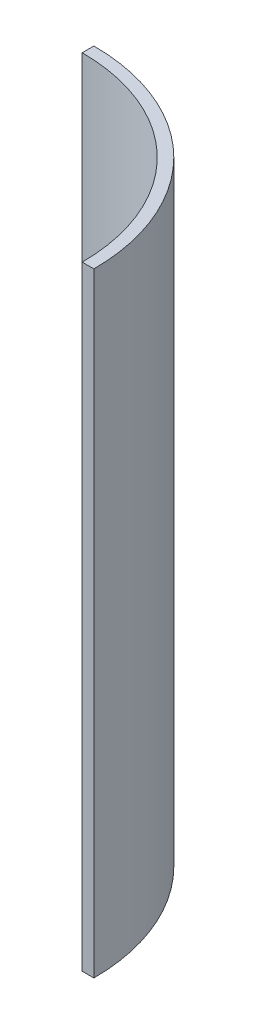
ISO-10303-21;
HEADER;
FILE_DESCRIPTION(('STEP AP214'),'2;1');
FILE_NAME('part.step','',(''),(''),'','','');
FILE_SCHEMA(('AUTOMOTIVE_DESIGN { 1 0 10303 214 1 1 1 1 }'));
ENDSEC;
DATA;
#1=APPLICATION_CONTEXT('core data for automotive mechanical design processes');
#2=APPLICATION_PROTOCOL_DEFINITION('international standard','automotive_design',2000,#1);
#3=PRODUCT_CONTEXT('',#1,'mechanical');
#4=PRODUCT('Part','Part','',(#3));
#5=PRODUCT_RELATED_PRODUCT_CATEGORY('part','',(#4));
#6=PRODUCT_DEFINITION_FORMATION('','',#4);
#7=PRODUCT_DEFINITION_CONTEXT('part definition',#1,'design');
#8=PRODUCT_DEFINITION('design','',#6,#7);
#9=PRODUCT_DEFINITION_SHAPE('','',#8);
#10=(LENGTH_UNIT() NAMED_UNIT(*) SI_UNIT(.MILLI.,.METRE.));
#11=(NAMED_UNIT(*) PLANE_ANGLE_UNIT() SI_UNIT($,.RADIAN.));
#12=(NAMED_UNIT(*) SI_UNIT($,.STERADIAN.) SOLID_ANGLE_UNIT());
#13=UNCERTAINTY_MEASURE_WITH_UNIT(LENGTH_MEASURE(1.E-05),#10,'distance_accuracy_value','');
#14=(GEOMETRIC_REPRESENTATION_CONTEXT(3) GLOBAL_UNCERTAINTY_ASSIGNED_CONTEXT((#13)) GLOBAL_UNIT_ASSIGNED_CONTEXT((#10,
#11,#12)) REPRESENTATION_CONTEXT('',''));
#15=CARTESIAN_POINT('',(0.,0.,0.));
#16=DIRECTION('',(0.,0.,1.));
#17=DIRECTION('',(1.,0.,0.));
#18=AXIS2_PLACEMENT_3D('',#15,#16,#17);
#19=CARTESIAN_POINT('',(0.,110.,0.));
#20=DIRECTION('',(0.,1.,0.));
#21=DIRECTION('',(0.,0.,1.));
#22=AXIS2_PLACEMENT_3D('',#19,#20,#21);
#23=PLANE('',#22);
#24=DIRECTION('',(0.,0.,-1.));
#25=VECTOR('',#24,1.);
#26=CARTESIAN_POINT('',(0.,110.,0.));
#27=LINE('',#26,#25);
#28=CARTESIAN_POINT('',(0.,110.,-31.));
#29=VERTEX_POINT('',#28);
#30=CARTESIAN_POINT('',(0.,110.,-33.));
#31=VERTEX_POINT('',#30);
#32=EDGE_CURVE('E73',#29,#31,#27,.T.);
#33=ORIENTED_EDGE('',*,*,#32,.F.);
#34=CARTESIAN_POINT('',(0.,110.,0.));
#35=DIRECTION('',(0.,1.,0.));
#36=DIRECTION('',(0.,0.,1.));
#37=AXIS2_PLACEMENT_3D('',#34,#35,#36);
#38=CIRCLE('',#37,31.);
#39=CARTESIAN_POINT('',(31.,110.,0.));
#40=VERTEX_POINT('',#39);
#41=EDGE_CURVE('E92',#40,#29,#38,.T.);
#42=ORIENTED_EDGE('',*,*,#41,.F.);
#43=DIRECTION('',(-1.,0.,0.));
#44=VECTOR('',#43,1.);
#45=CARTESIAN_POINT('',(0.,110.,0.));
#46=LINE('',#45,#44);
#47=CARTESIAN_POINT('',(33.,110.,0.));
#48=VERTEX_POINT('',#47);
#49=EDGE_CURVE('E54',#48,#40,#46,.T.);
#50=ORIENTED_EDGE('',*,*,#49,.F.);
#51=CARTESIAN_POINT('',(0.,110.,0.));
#52=DIRECTION('',(0.,1.,0.));
#53=DIRECTION('',(0.,0.,1.));
#54=AXIS2_PLACEMENT_3D('',#51,#52,#53);
#55=CIRCLE('',#54,33.);
#56=EDGE_CURVE('E91',#48,#31,#55,.T.);
#57=ORIENTED_EDGE('',*,*,#56,.T.);
#58=EDGE_LOOP('',(#33,#42,#50,#57));
#59=FACE_BOUND('',#58,.T.);
#60=ADVANCED_FACE('F32',(#59),#23,.T.);
#61=CARTESIAN_POINT('',(0.,5.,0.));
#62=DIRECTION('',(0.,1.,0.));
#63=DIRECTION('',(0.,0.,1.));
#64=AXIS2_PLACEMENT_3D('',#61,#62,#63);
#65=PLANE('',#64);
#66=CARTESIAN_POINT('',(0.,5.,0.));
#67=DIRECTION('',(0.,1.,0.));
#68=DIRECTION('',(0.,0.,1.));
#69=AXIS2_PLACEMENT_3D('',#66,#67,#68);
#70=CIRCLE('',#69,31.);
#71=CARTESIAN_POINT('',(31.,5.,0.));
#72=VERTEX_POINT('',#71);
#73=CARTESIAN_POINT('',(0.,5.,-31.));
#74=VERTEX_POINT('',#73);
#75=EDGE_CURVE('E78',#72,#74,#70,.T.);
#76=ORIENTED_EDGE('',*,*,#75,.T.);
#77=DIRECTION('',(0.,0.,-1.));
#78=VECTOR('',#77,1.);
#79=CARTESIAN_POINT('',(0.,5.,0.));
#80=LINE('',#79,#78);
#81=CARTESIAN_POINT('',(0.,5.,-33.));
#82=VERTEX_POINT('',#81);
#83=EDGE_CURVE('E46',#74,#82,#80,.T.);
#84=ORIENTED_EDGE('',*,*,#83,.T.);
#85=CARTESIAN_POINT('',(0.,5.,0.));
#86=DIRECTION('',(0.,1.,0.));
#87=DIRECTION('',(0.,0.,1.));
#88=AXIS2_PLACEMENT_3D('',#85,#86,#87);
#89=CIRCLE('',#88,33.);
#90=CARTESIAN_POINT('',(33.,5.,0.));
#91=VERTEX_POINT('',#90);
#92=EDGE_CURVE('E85',#91,#82,#89,.T.);
#93=ORIENTED_EDGE('',*,*,#92,.F.);
#94=DIRECTION('',(-1.,0.,0.));
#95=VECTOR('',#94,1.);
#96=CARTESIAN_POINT('',(0.,5.,0.));
#97=LINE('',#96,#95);
#98=EDGE_CURVE('E87',#91,#72,#97,.T.);
#99=ORIENTED_EDGE('',*,*,#98,.T.);
#100=EDGE_LOOP('',(#76,#84,#93,#99));
#101=FACE_BOUND('',#100,.T.);
#102=ADVANCED_FACE('F83',(#101),#65,.F.);
#103=CARTESIAN_POINT('',(0.,110.,0.));
#104=DIRECTION('',(0.,-1.,0.));
#105=DIRECTION('',(0.,0.,-1.));
#106=AXIS2_PLACEMENT_3D('',#103,#104,#105);
#107=CYLINDRICAL_SURFACE('',#106,33.);
#108=ORIENTED_EDGE('',*,*,#92,.T.);
#109=DIRECTION('',(0.,-1.,0.));
#110=VECTOR('',#109,1.);
#111=CARTESIAN_POINT('',(0.,110.,-33.));
#112=LINE('',#111,#110);
#113=EDGE_CURVE('E70',#82,#31,#112,.F.);
#114=ORIENTED_EDGE('',*,*,#113,.T.);
#115=ORIENTED_EDGE('',*,*,#56,.F.);
#116=DIRECTION('',(0.,-1.,0.));
#117=VECTOR('',#116,1.);
#118=CARTESIAN_POINT('',(33.,110.,0.));
#119=LINE('',#118,#117);
#120=EDGE_CURVE('E90',#48,#91,#119,.T.);
#121=ORIENTED_EDGE('',*,*,#120,.T.);
#122=EDGE_LOOP('',(#108,#114,#115,#121));
#123=FACE_BOUND('',#122,.T.);
#124=ADVANCED_FACE('F34',(#123),#107,.T.);
#125=CARTESIAN_POINT('',(0.,110.,0.));
#126=DIRECTION('',(0.,-1.,0.));
#127=DIRECTION('',(0.,0.,-1.));
#128=AXIS2_PLACEMENT_3D('',#125,#126,#127);
#129=CYLINDRICAL_SURFACE('',#128,31.);
#130=DIRECTION('',(0.,-1.,0.));
#131=VECTOR('',#130,1.);
#132=CARTESIAN_POINT('',(0.,110.,-31.));
#133=LINE('',#132,#131);
#134=EDGE_CURVE('E11',#74,#29,#133,.F.);
#135=ORIENTED_EDGE('',*,*,#134,.F.);
#136=ORIENTED_EDGE('',*,*,#75,.F.);
#137=DIRECTION('',(0.,-1.,0.));
#138=VECTOR('',#137,1.);
#139=CARTESIAN_POINT('',(31.,110.,0.));
#140=LINE('',#139,#138);
#141=EDGE_CURVE('E40',#40,#72,#140,.T.);
#142=ORIENTED_EDGE('',*,*,#141,.F.);
#143=ORIENTED_EDGE('',*,*,#41,.T.);
#144=EDGE_LOOP('',(#135,#136,#142,#143));
#145=FACE_BOUND('',#144,.T.);
#146=ADVANCED_FACE('F102',(#145),#129,.F.);
#147=CARTESIAN_POINT('',(0.,5.,0.));
#148=DIRECTION('',(0.,0.,-1.));
#149=DIRECTION('',(-1.,0.,0.));
#150=AXIS2_PLACEMENT_3D('',#147,#148,#149);
#151=PLANE('',#150);
#152=ORIENTED_EDGE('',*,*,#49,.T.);
#153=ORIENTED_EDGE('',*,*,#141,.T.);
#154=ORIENTED_EDGE('',*,*,#98,.F.);
#155=ORIENTED_EDGE('',*,*,#120,.F.);
#156=EDGE_LOOP('',(#152,#153,#154,#155));
#157=FACE_BOUND('',#156,.T.);
#158=ADVANCED_FACE('F98',(#157),#151,.F.);
#159=CARTESIAN_POINT('',(0.,5.,0.));
#160=DIRECTION('',(1.,0.,0.));
#161=DIRECTION('',(0.,0.,-1.));
#162=AXIS2_PLACEMENT_3D('',#159,#160,#161);
#163=PLANE('',#162);
#164=ORIENTED_EDGE('',*,*,#83,.F.);
#165=ORIENTED_EDGE('',*,*,#134,.T.);
#166=ORIENTED_EDGE('',*,*,#32,.T.);
#167=ORIENTED_EDGE('',*,*,#113,.F.);
#168=EDGE_LOOP('',(#164,#165,#166,#167));
#169=FACE_BOUND('',#168,.T.);
#170=ADVANCED_FACE('F71',(#169),#163,.F.);
#171=CLOSED_SHELL('',(#60,#102,#124,#146,#158,#170));
#172=MANIFOLD_SOLID_BREP('B2',#171);
#173=ADVANCED_BREP_SHAPE_REPRESENTATION('',(#18,#172),#14);
#174=SHAPE_DEFINITION_REPRESENTATION(#9,#173);
ENDSEC;
END-ISO-10303-21;
